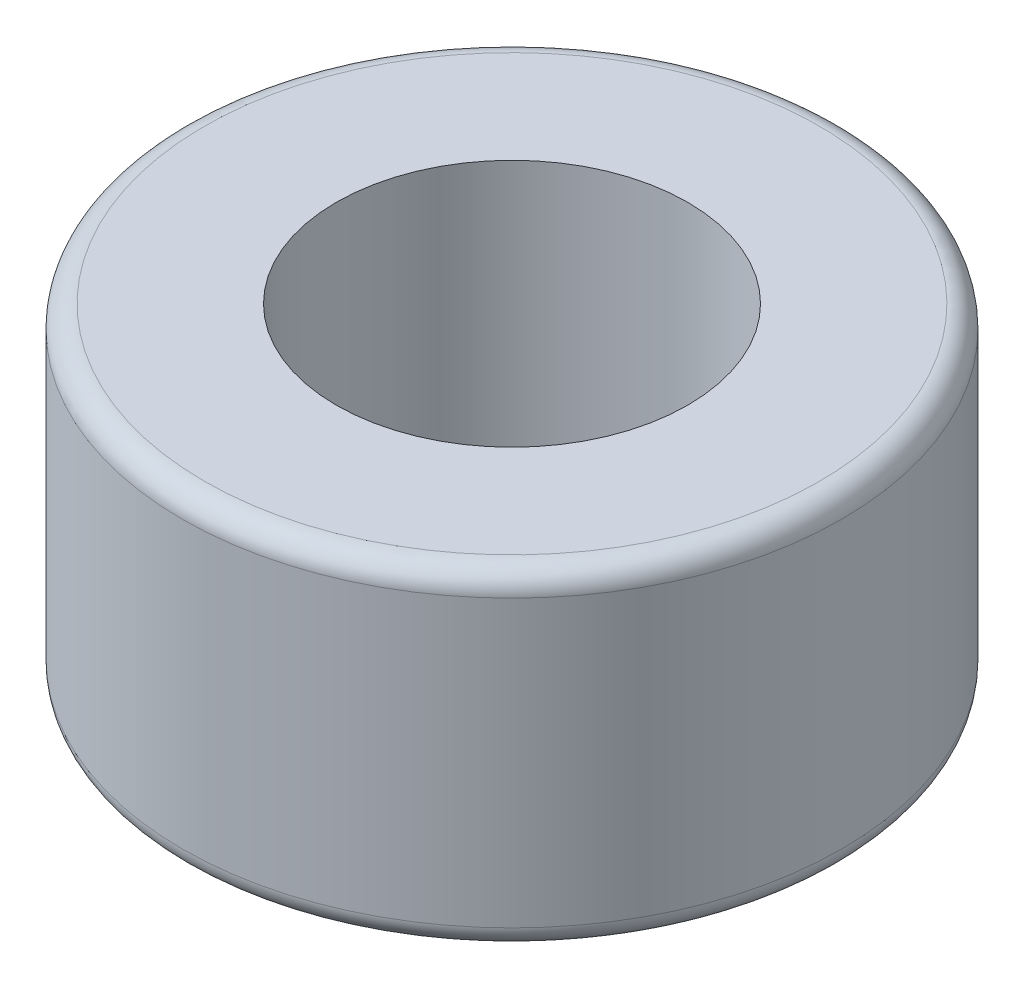
ISO-10303-21;
HEADER;
FILE_DESCRIPTION(('STEP AP214'),'2;1');
FILE_NAME('part.step','',(''),(''),'','','');
FILE_SCHEMA(('AUTOMOTIVE_DESIGN { 1 0 10303 214 1 1 1 1 }'));
ENDSEC;
DATA;
#1=APPLICATION_CONTEXT('core data for automotive mechanical design processes');
#2=APPLICATION_PROTOCOL_DEFINITION('international standard','automotive_design',2000,#1);
#3=PRODUCT_CONTEXT('',#1,'mechanical');
#4=PRODUCT('Part','Part','',(#3));
#5=PRODUCT_RELATED_PRODUCT_CATEGORY('part','',(#4));
#6=PRODUCT_DEFINITION_FORMATION('','',#4);
#7=PRODUCT_DEFINITION_CONTEXT('part definition',#1,'design');
#8=PRODUCT_DEFINITION('design','',#6,#7);
#9=PRODUCT_DEFINITION_SHAPE('','',#8);
#10=(LENGTH_UNIT() NAMED_UNIT(*) SI_UNIT(.MILLI.,.METRE.));
#11=(NAMED_UNIT(*) PLANE_ANGLE_UNIT() SI_UNIT($,.RADIAN.));
#12=(NAMED_UNIT(*) SI_UNIT($,.STERADIAN.) SOLID_ANGLE_UNIT());
#13=UNCERTAINTY_MEASURE_WITH_UNIT(LENGTH_MEASURE(1.E-05),#10,'distance_accuracy_value','');
#14=(GEOMETRIC_REPRESENTATION_CONTEXT(3) GLOBAL_UNCERTAINTY_ASSIGNED_CONTEXT((#13)) GLOBAL_UNIT_ASSIGNED_CONTEXT((#10,
#11,#12)) REPRESENTATION_CONTEXT('',''));
#15=CARTESIAN_POINT('',(0.,0.,0.));
#16=DIRECTION('',(0.,0.,1.));
#17=DIRECTION('',(1.,0.,0.));
#18=AXIS2_PLACEMENT_3D('',#15,#16,#17);
#19=CARTESIAN_POINT('',(0.,3.,0.));
#20=DIRECTION('',(0.,-1.,0.));
#21=DIRECTION('',(0.,0.,-1.));
#22=AXIS2_PLACEMENT_3D('',#19,#20,#21);
#23=CYLINDRICAL_SURFACE('',#22,3.);
#24=CARTESIAN_POINT('',(0.,0.2,0.));
#25=DIRECTION('',(0.,1.,0.));
#26=DIRECTION('',(0.,0.,1.));
#27=AXIS2_PLACEMENT_3D('',#24,#25,#26);
#28=CIRCLE('',#27,3.);
#29=CARTESIAN_POINT('',(0.,0.2,3.));
#30=VERTEX_POINT('',#29);
#31=EDGE_CURVE('E42',#30,#30,#28,.T.);
#32=ORIENTED_EDGE('',*,*,#31,.T.);
#33=EDGE_LOOP('',(#32));
#34=FACE_BOUND('',#33,.T.);
#35=CARTESIAN_POINT('',(0.,2.8,0.));
#36=DIRECTION('',(0.,1.,0.));
#37=DIRECTION('',(0.,0.,1.));
#38=AXIS2_PLACEMENT_3D('',#35,#36,#37);
#39=CIRCLE('',#38,3.);
#40=CARTESIAN_POINT('',(0.,2.8,3.));
#41=VERTEX_POINT('',#40);
#42=EDGE_CURVE('E46',#41,#41,#39,.F.);
#43=ORIENTED_EDGE('',*,*,#42,.T.);
#44=EDGE_LOOP('',(#43));
#45=FACE_BOUND('',#44,.T.);
#46=ADVANCED_FACE('F31',(#34,#45),#23,.T.);
#47=CARTESIAN_POINT('',(0.,3.,0.));
#48=DIRECTION('',(0.,1.,0.));
#49=DIRECTION('',(0.,0.,1.));
#50=AXIS2_PLACEMENT_3D('',#47,#48,#49);
#51=PLANE('',#50);
#52=CARTESIAN_POINT('',(0.,3.,0.));
#53=DIRECTION('',(0.,1.,0.));
#54=DIRECTION('',(0.,0.,1.));
#55=AXIS2_PLACEMENT_3D('',#52,#53,#54);
#56=CIRCLE('',#55,2.8);
#57=CARTESIAN_POINT('',(0.,3.,2.8));
#58=VERTEX_POINT('',#57);
#59=EDGE_CURVE('E10',#58,#58,#56,.T.);
#60=ORIENTED_EDGE('',*,*,#59,.T.);
#61=EDGE_LOOP('',(#60));
#62=FACE_BOUND('',#61,.T.);
#63=CARTESIAN_POINT('',(0.,3.,0.));
#64=DIRECTION('',(0.,1.,0.));
#65=DIRECTION('',(0.,0.,1.));
#66=AXIS2_PLACEMENT_3D('',#63,#64,#65);
#67=CIRCLE('',#66,1.6);
#68=CARTESIAN_POINT('',(0.,3.,1.6));
#69=VERTEX_POINT('',#68);
#70=EDGE_CURVE('E52',#69,#69,#67,.T.);
#71=ORIENTED_EDGE('',*,*,#70,.F.);
#72=EDGE_LOOP('',(#71));
#73=FACE_BOUND('',#72,.T.);
#74=ADVANCED_FACE('F67',(#62,#73),#51,.T.);
#75=CARTESIAN_POINT('',(0.,0.,0.));
#76=DIRECTION('',(0.,1.,0.));
#77=DIRECTION('',(0.,0.,1.));
#78=AXIS2_PLACEMENT_3D('',#75,#76,#77);
#79=PLANE('',#78);
#80=CARTESIAN_POINT('',(0.,0.,0.));
#81=DIRECTION('',(0.,1.,0.));
#82=DIRECTION('',(0.,0.,1.));
#83=AXIS2_PLACEMENT_3D('',#80,#81,#82);
#84=CIRCLE('',#83,2.8);
#85=CARTESIAN_POINT('',(0.,0.,2.8));
#86=VERTEX_POINT('',#85);
#87=EDGE_CURVE('E38',#86,#86,#84,.F.);
#88=ORIENTED_EDGE('',*,*,#87,.T.);
#89=EDGE_LOOP('',(#88));
#90=FACE_BOUND('',#89,.T.);
#91=CARTESIAN_POINT('',(0.,0.,0.));
#92=DIRECTION('',(0.,1.,0.));
#93=DIRECTION('',(0.,0.,1.));
#94=AXIS2_PLACEMENT_3D('',#91,#92,#93);
#95=CIRCLE('',#94,1.6);
#96=CARTESIAN_POINT('',(0.,0.,1.6));
#97=VERTEX_POINT('',#96);
#98=EDGE_CURVE('E51',#97,#97,#95,.T.);
#99=ORIENTED_EDGE('',*,*,#98,.T.);
#100=EDGE_LOOP('',(#99));
#101=FACE_BOUND('',#100,.T.);
#102=ADVANCED_FACE('F58',(#90,#101),#79,.F.);
#103=CARTESIAN_POINT('',(0.,0.,0.));
#104=DIRECTION('',(0.,1.,0.));
#105=DIRECTION('',(0.,0.,1.));
#106=AXIS2_PLACEMENT_3D('',#103,#104,#105);
#107=CYLINDRICAL_SURFACE('',#106,1.6);
#108=ORIENTED_EDGE('',*,*,#98,.F.);
#109=EDGE_LOOP('',(#108));
#110=FACE_BOUND('',#109,.T.);
#111=ORIENTED_EDGE('',*,*,#70,.T.);
#112=EDGE_LOOP('',(#111));
#113=FACE_BOUND('',#112,.T.);
#114=ADVANCED_FACE('F60',(#110,#113),#107,.F.);
#115=CARTESIAN_POINT('',(0.,0.2,0.));
#116=DIRECTION('',(0.,1.,0.));
#117=DIRECTION('',(0.,0.,1.));
#118=AXIS2_PLACEMENT_3D('',#115,#116,#117);
#119=TOROIDAL_SURFACE('',#118,2.8,0.2);
#120=ORIENTED_EDGE('',*,*,#87,.F.);
#121=EDGE_LOOP('',(#120));
#122=FACE_BOUND('',#121,.T.);
#123=ORIENTED_EDGE('',*,*,#31,.F.);
#124=EDGE_LOOP('',(#123));
#125=FACE_BOUND('',#124,.T.);
#126=ADVANCED_FACE('F63',(#122,#125),#119,.T.);
#127=CARTESIAN_POINT('',(0.,2.8,0.));
#128=DIRECTION('',(0.,1.,0.));
#129=DIRECTION('',(0.,0.,1.));
#130=AXIS2_PLACEMENT_3D('',#127,#128,#129);
#131=TOROIDAL_SURFACE('',#130,2.8,0.2);
#132=ORIENTED_EDGE('',*,*,#42,.F.);
#133=EDGE_LOOP('',(#132));
#134=FACE_BOUND('',#133,.T.);
#135=ORIENTED_EDGE('',*,*,#59,.F.);
#136=EDGE_LOOP('',(#135));
#137=FACE_BOUND('',#136,.T.);
#138=ADVANCED_FACE('F33',(#134,#137),#131,.T.);
#139=CLOSED_SHELL('',(#46,#74,#102,#114,#126,#138));
#140=MANIFOLD_SOLID_BREP('B2',#139);
#141=ADVANCED_BREP_SHAPE_REPRESENTATION('',(#18,#140),#14);
#142=SHAPE_DEFINITION_REPRESENTATION(#9,#141);
ENDSEC;
END-ISO-10303-21;
